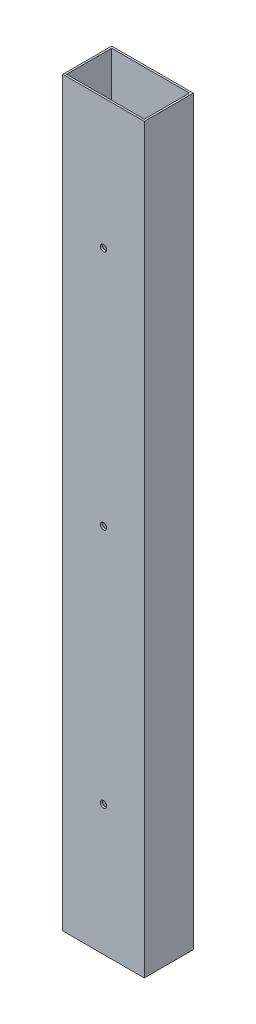
ISO-10303-21;
HEADER;
FILE_DESCRIPTION(('STEP AP214'),'2;1');
FILE_NAME('part.step','',(''),(''),'','','');
FILE_SCHEMA(('AUTOMOTIVE_DESIGN { 1 0 10303 214 1 1 1 1 }'));
ENDSEC;
DATA;
#1=APPLICATION_CONTEXT('core data for automotive mechanical design processes');
#2=APPLICATION_PROTOCOL_DEFINITION('international standard','automotive_design',2000,#1);
#3=PRODUCT_CONTEXT('',#1,'mechanical');
#4=PRODUCT('Part','Part','',(#3));
#5=PRODUCT_RELATED_PRODUCT_CATEGORY('part','',(#4));
#6=PRODUCT_DEFINITION_FORMATION('','',#4);
#7=PRODUCT_DEFINITION_CONTEXT('part definition',#1,'design');
#8=PRODUCT_DEFINITION('design','',#6,#7);
#9=PRODUCT_DEFINITION_SHAPE('','',#8);
#10=(LENGTH_UNIT() NAMED_UNIT(*) SI_UNIT(.MILLI.,.METRE.));
#11=(NAMED_UNIT(*) PLANE_ANGLE_UNIT() SI_UNIT($,.RADIAN.));
#12=(NAMED_UNIT(*) SI_UNIT($,.STERADIAN.) SOLID_ANGLE_UNIT());
#13=UNCERTAINTY_MEASURE_WITH_UNIT(LENGTH_MEASURE(1.E-05),#10,'distance_accuracy_value','');
#14=(GEOMETRIC_REPRESENTATION_CONTEXT(3) GLOBAL_UNCERTAINTY_ASSIGNED_CONTEXT((#13)) GLOBAL_UNIT_ASSIGNED_CONTEXT((#10,
#11,#12)) REPRESENTATION_CONTEXT('',''));
#15=CARTESIAN_POINT('',(0.,0.,0.));
#16=DIRECTION('',(0.,0.,1.));
#17=DIRECTION('',(1.,0.,0.));
#18=AXIS2_PLACEMENT_3D('',#15,#16,#17);
#19=CARTESIAN_POINT('',(0.,462.,0.));
#20=DIRECTION('',(0.,-1.,0.));
#21=DIRECTION('',(0.,0.,-1.));
#22=AXIS2_PLACEMENT_3D('',#19,#20,#21);
#23=PLANE('',#22);
#24=DIRECTION('',(0.,0.,-1.));
#25=VECTOR('',#24,1.);
#26=CARTESIAN_POINT('',(25.4,462.,15.25));
#27=LINE('',#26,#25);
#28=CARTESIAN_POINT('',(25.4,462.,15.25));
#29=VERTEX_POINT('',#28);
#30=CARTESIAN_POINT('',(25.4,462.,-15.25));
#31=VERTEX_POINT('',#30);
#32=EDGE_CURVE('E156',#29,#31,#27,.T.);
#33=ORIENTED_EDGE('',*,*,#32,.T.);
#34=DIRECTION('',(-1.,0.,0.));
#35=VECTOR('',#34,1.);
#36=CARTESIAN_POINT('',(-25.4,462.,-15.25));
#37=LINE('',#36,#35);
#38=CARTESIAN_POINT('',(-25.4,462.,-15.25));
#39=VERTEX_POINT('',#38);
#40=EDGE_CURVE('E160',#31,#39,#37,.T.);
#41=ORIENTED_EDGE('',*,*,#40,.T.);
#42=DIRECTION('',(0.,0.,1.));
#43=VECTOR('',#42,1.);
#44=CARTESIAN_POINT('',(-25.4,462.,15.25));
#45=LINE('',#44,#43);
#46=CARTESIAN_POINT('',(-25.4,462.,15.25));
#47=VERTEX_POINT('',#46);
#48=EDGE_CURVE('E164',#39,#47,#45,.T.);
#49=ORIENTED_EDGE('',*,*,#48,.T.);
#50=DIRECTION('',(1.,0.,0.));
#51=VECTOR('',#50,1.);
#52=CARTESIAN_POINT('',(-25.4,462.,15.25));
#53=LINE('',#52,#51);
#54=EDGE_CURVE('E167',#47,#29,#53,.T.);
#55=ORIENTED_EDGE('',*,*,#54,.T.);
#56=EDGE_LOOP('',(#33,#41,#49,#55));
#57=FACE_BOUND('',#56,.T.);
#58=DIRECTION('',(0.,0.,1.));
#59=VECTOR('',#58,1.);
#60=CARTESIAN_POINT('',(-24.2,462.,14.05));
#61=LINE('',#60,#59);
#62=CARTESIAN_POINT('',(-24.2,462.,-14.05));
#63=VERTEX_POINT('',#62);
#64=CARTESIAN_POINT('',(-24.2,462.,14.05));
#65=VERTEX_POINT('',#64);
#66=EDGE_CURVE('E106',#63,#65,#61,.T.);
#67=ORIENTED_EDGE('',*,*,#66,.F.);
#68=DIRECTION('',(-1.,0.,0.));
#69=VECTOR('',#68,1.);
#70=CARTESIAN_POINT('',(-24.2,462.,-14.05));
#71=LINE('',#70,#69);
#72=CARTESIAN_POINT('',(24.2,462.,-14.05));
#73=VERTEX_POINT('',#72);
#74=EDGE_CURVE('E132',#73,#63,#71,.T.);
#75=ORIENTED_EDGE('',*,*,#74,.F.);
#76=DIRECTION('',(0.,0.,-1.));
#77=VECTOR('',#76,1.);
#78=CARTESIAN_POINT('',(24.2,462.,14.05));
#79=LINE('',#78,#77);
#80=CARTESIAN_POINT('',(24.2,462.,14.05));
#81=VERTEX_POINT('',#80);
#82=EDGE_CURVE('E128',#81,#73,#79,.T.);
#83=ORIENTED_EDGE('',*,*,#82,.F.);
#84=DIRECTION('',(1.,0.,0.));
#85=VECTOR('',#84,1.);
#86=CARTESIAN_POINT('',(-24.2,462.,14.05));
#87=LINE('',#86,#85);
#88=EDGE_CURVE('E115',#65,#81,#87,.T.);
#89=ORIENTED_EDGE('',*,*,#88,.F.);
#90=EDGE_LOOP('',(#67,#75,#83,#89));
#91=FACE_BOUND('',#90,.T.);
#92=ADVANCED_FACE('F38',(#57,#91),#23,.F.);
#93=CARTESIAN_POINT('',(0.,0.,0.));
#94=DIRECTION('',(0.,-1.,0.));
#95=DIRECTION('',(0.,0.,-1.));
#96=AXIS2_PLACEMENT_3D('',#93,#94,#95);
#97=PLANE('',#96);
#98=DIRECTION('',(0.,0.,-1.));
#99=VECTOR('',#98,1.);
#100=CARTESIAN_POINT('',(25.4,0.,15.25));
#101=LINE('',#100,#99);
#102=CARTESIAN_POINT('',(25.4,0.,15.25));
#103=VERTEX_POINT('',#102);
#104=CARTESIAN_POINT('',(25.4,0.,-15.25));
#105=VERTEX_POINT('',#104);
#106=EDGE_CURVE('E124',#103,#105,#101,.T.);
#107=ORIENTED_EDGE('',*,*,#106,.F.);
#108=DIRECTION('',(1.,0.,0.));
#109=VECTOR('',#108,1.);
#110=CARTESIAN_POINT('',(-25.4,0.,15.25));
#111=LINE('',#110,#109);
#112=CARTESIAN_POINT('',(-25.4,0.,15.25));
#113=VERTEX_POINT('',#112);
#114=EDGE_CURVE('E161',#113,#103,#111,.T.);
#115=ORIENTED_EDGE('',*,*,#114,.F.);
#116=DIRECTION('',(0.,0.,1.));
#117=VECTOR('',#116,1.);
#118=CARTESIAN_POINT('',(-25.4,0.,15.25));
#119=LINE('',#118,#117);
#120=CARTESIAN_POINT('',(-25.4,0.,-15.25));
#121=VERTEX_POINT('',#120);
#122=EDGE_CURVE('E177',#121,#113,#119,.T.);
#123=ORIENTED_EDGE('',*,*,#122,.F.);
#124=DIRECTION('',(-1.,0.,0.));
#125=VECTOR('',#124,1.);
#126=CARTESIAN_POINT('',(-25.4,0.,-15.25));
#127=LINE('',#126,#125);
#128=EDGE_CURVE('E174',#105,#121,#127,.T.);
#129=ORIENTED_EDGE('',*,*,#128,.F.);
#130=EDGE_LOOP('',(#107,#115,#123,#129));
#131=FACE_BOUND('',#130,.T.);
#132=DIRECTION('',(-1.,0.,0.));
#133=VECTOR('',#132,1.);
#134=CARTESIAN_POINT('',(-24.2,0.,-14.05));
#135=LINE('',#134,#133);
#136=CARTESIAN_POINT('',(24.2,0.,-14.05));
#137=VERTEX_POINT('',#136);
#138=CARTESIAN_POINT('',(-24.2,0.,-14.05));
#139=VERTEX_POINT('',#138);
#140=EDGE_CURVE('E116',#137,#139,#135,.T.);
#141=ORIENTED_EDGE('',*,*,#140,.T.);
#142=DIRECTION('',(0.,0.,1.));
#143=VECTOR('',#142,1.);
#144=CARTESIAN_POINT('',(-24.2,0.,14.05));
#145=LINE('',#144,#143);
#146=CARTESIAN_POINT('',(-24.2,0.,14.05));
#147=VERTEX_POINT('',#146);
#148=EDGE_CURVE('E64',#139,#147,#145,.T.);
#149=ORIENTED_EDGE('',*,*,#148,.T.);
#150=DIRECTION('',(1.,0.,0.));
#151=VECTOR('',#150,1.);
#152=CARTESIAN_POINT('',(-24.2,0.,14.05));
#153=LINE('',#152,#151);
#154=CARTESIAN_POINT('',(24.2,0.,14.05));
#155=VERTEX_POINT('',#154);
#156=EDGE_CURVE('E122',#147,#155,#153,.T.);
#157=ORIENTED_EDGE('',*,*,#156,.T.);
#158=DIRECTION('',(0.,0.,-1.));
#159=VECTOR('',#158,1.);
#160=CARTESIAN_POINT('',(24.2,0.,14.05));
#161=LINE('',#160,#159);
#162=EDGE_CURVE('E143',#155,#137,#161,.T.);
#163=ORIENTED_EDGE('',*,*,#162,.T.);
#164=EDGE_LOOP('',(#141,#149,#157,#163));
#165=FACE_BOUND('',#164,.T.);
#166=ADVANCED_FACE('F235',(#131,#165),#97,.T.);
#167=CARTESIAN_POINT('',(25.4,462.,15.25));
#168=DIRECTION('',(-1.,0.,0.));
#169=DIRECTION('',(0.,0.,1.));
#170=AXIS2_PLACEMENT_3D('',#167,#168,#169);
#171=PLANE('',#170);
#172=ORIENTED_EDGE('',*,*,#106,.T.);
#173=DIRECTION('',(0.,-1.,0.));
#174=VECTOR('',#173,1.);
#175=CARTESIAN_POINT('',(25.4,462.,-15.25));
#176=LINE('',#175,#174);
#177=EDGE_CURVE('E11',#31,#105,#176,.T.);
#178=ORIENTED_EDGE('',*,*,#177,.F.);
#179=ORIENTED_EDGE('',*,*,#32,.F.);
#180=DIRECTION('',(0.,-1.,0.));
#181=VECTOR('',#180,1.);
#182=CARTESIAN_POINT('',(25.4,462.,15.25));
#183=LINE('',#182,#181);
#184=EDGE_CURVE('E170',#29,#103,#183,.T.);
#185=ORIENTED_EDGE('',*,*,#184,.T.);
#186=EDGE_LOOP('',(#172,#178,#179,#185));
#187=FACE_BOUND('',#186,.T.);
#188=ADVANCED_FACE('F40',(#187),#171,.F.);
#189=CARTESIAN_POINT('',(-25.4,462.,-15.25));
#190=DIRECTION('',(0.,0.,1.));
#191=DIRECTION('',(1.,0.,0.));
#192=AXIS2_PLACEMENT_3D('',#189,#190,#191);
#193=PLANE('',#192);
#194=CARTESIAN_POINT('',(0.,81.,-15.25));
#195=DIRECTION('',(0.,0.,-1.));
#196=DIRECTION('',(-1.,0.,0.));
#197=AXIS2_PLACEMENT_3D('',#194,#195,#196);
#198=CIRCLE('',#197,2.);
#199=CARTESIAN_POINT('',(-2.00000000000002,81.,-15.25));
#200=VERTEX_POINT('',#199);
#201=EDGE_CURVE('E273',#200,#200,#198,.T.);
#202=ORIENTED_EDGE('',*,*,#201,.F.);
#203=EDGE_LOOP('',(#202));
#204=FACE_BOUND('',#203,.T.);
#205=CARTESIAN_POINT('',(0.,381.,-15.25));
#206=DIRECTION('',(0.,0.,-1.));
#207=DIRECTION('',(-1.,0.,0.));
#208=AXIS2_PLACEMENT_3D('',#205,#206,#207);
#209=CIRCLE('',#208,2.);
#210=CARTESIAN_POINT('',(-2.00000000000001,381.,-15.25));
#211=VERTEX_POINT('',#210);
#212=EDGE_CURVE('E277',#211,#211,#209,.T.);
#213=ORIENTED_EDGE('',*,*,#212,.F.);
#214=EDGE_LOOP('',(#213));
#215=FACE_BOUND('',#214,.T.);
#216=CARTESIAN_POINT('',(0.,231.,-15.25));
#217=DIRECTION('',(0.,0.,-1.));
#218=DIRECTION('',(-1.,0.,0.));
#219=AXIS2_PLACEMENT_3D('',#216,#217,#218);
#220=CIRCLE('',#219,2.);
#221=CARTESIAN_POINT('',(-2.00000000000001,231.,-15.25));
#222=VERTEX_POINT('',#221);
#223=EDGE_CURVE('E212',#222,#222,#220,.T.);
#224=ORIENTED_EDGE('',*,*,#223,.F.);
#225=EDGE_LOOP('',(#224));
#226=FACE_BOUND('',#225,.T.);
#227=ORIENTED_EDGE('',*,*,#128,.T.);
#228=DIRECTION('',(0.,-1.,0.));
#229=VECTOR('',#228,1.);
#230=CARTESIAN_POINT('',(-25.4,462.,-15.25));
#231=LINE('',#230,#229);
#232=EDGE_CURVE('E48',#39,#121,#231,.T.);
#233=ORIENTED_EDGE('',*,*,#232,.F.);
#234=ORIENTED_EDGE('',*,*,#40,.F.);
#235=ORIENTED_EDGE('',*,*,#177,.T.);
#236=EDGE_LOOP('',(#227,#233,#234,#235));
#237=FACE_BOUND('',#236,.T.);
#238=ADVANCED_FACE('F262',(#204,#215,#226,#237),#193,.F.);
#239=CARTESIAN_POINT('',(-25.4,462.,15.25));
#240=DIRECTION('',(1.,0.,0.));
#241=DIRECTION('',(0.,0.,-1.));
#242=AXIS2_PLACEMENT_3D('',#239,#240,#241);
#243=PLANE('',#242);
#244=ORIENTED_EDGE('',*,*,#122,.T.);
#245=DIRECTION('',(0.,-1.,0.));
#246=VECTOR('',#245,1.);
#247=CARTESIAN_POINT('',(-25.4,462.,15.25));
#248=LINE('',#247,#246);
#249=EDGE_CURVE('E185',#47,#113,#248,.T.);
#250=ORIENTED_EDGE('',*,*,#249,.F.);
#251=ORIENTED_EDGE('',*,*,#48,.F.);
#252=ORIENTED_EDGE('',*,*,#232,.T.);
#253=EDGE_LOOP('',(#244,#250,#251,#252));
#254=FACE_BOUND('',#253,.T.);
#255=ADVANCED_FACE('F259',(#254),#243,.F.);
#256=CARTESIAN_POINT('',(-25.4,462.,15.25));
#257=DIRECTION('',(0.,0.,-1.));
#258=DIRECTION('',(-1.,0.,0.));
#259=AXIS2_PLACEMENT_3D('',#256,#257,#258);
#260=PLANE('',#259);
#261=CARTESIAN_POINT('',(0.,81.,15.25));
#262=DIRECTION('',(0.,0.,-1.));
#263=DIRECTION('',(-1.,0.,0.));
#264=AXIS2_PLACEMENT_3D('',#261,#262,#263);
#265=CIRCLE('',#264,2.);
#266=CARTESIAN_POINT('',(-2.00000000000002,81.,15.25));
#267=VERTEX_POINT('',#266);
#268=EDGE_CURVE('E303',#267,#267,#265,.T.);
#269=ORIENTED_EDGE('',*,*,#268,.T.);
#270=EDGE_LOOP('',(#269));
#271=FACE_BOUND('',#270,.T.);
#272=CARTESIAN_POINT('',(0.,381.,15.25));
#273=DIRECTION('',(0.,0.,-1.));
#274=DIRECTION('',(-1.,0.,0.));
#275=AXIS2_PLACEMENT_3D('',#272,#273,#274);
#276=CIRCLE('',#275,2.);
#277=CARTESIAN_POINT('',(-2.00000000000001,381.,15.25));
#278=VERTEX_POINT('',#277);
#279=EDGE_CURVE('E294',#278,#278,#276,.T.);
#280=ORIENTED_EDGE('',*,*,#279,.T.);
#281=EDGE_LOOP('',(#280));
#282=FACE_BOUND('',#281,.T.);
#283=CARTESIAN_POINT('',(0.,231.,15.25));
#284=DIRECTION('',(0.,0.,-1.));
#285=DIRECTION('',(-1.,0.,0.));
#286=AXIS2_PLACEMENT_3D('',#283,#284,#285);
#287=CIRCLE('',#286,2.);
#288=CARTESIAN_POINT('',(-2.00000000000001,231.,15.25));
#289=VERTEX_POINT('',#288);
#290=EDGE_CURVE('E196',#289,#289,#287,.T.);
#291=ORIENTED_EDGE('',*,*,#290,.T.);
#292=EDGE_LOOP('',(#291));
#293=FACE_BOUND('',#292,.T.);
#294=ORIENTED_EDGE('',*,*,#114,.T.);
#295=ORIENTED_EDGE('',*,*,#184,.F.);
#296=ORIENTED_EDGE('',*,*,#54,.F.);
#297=ORIENTED_EDGE('',*,*,#249,.T.);
#298=EDGE_LOOP('',(#294,#295,#296,#297));
#299=FACE_BOUND('',#298,.T.);
#300=ADVANCED_FACE('F256',(#271,#282,#293,#299),#260,.F.);
#301=CARTESIAN_POINT('',(-24.2,462.,14.05));
#302=DIRECTION('',(1.,0.,0.));
#303=DIRECTION('',(0.,0.,-1.));
#304=AXIS2_PLACEMENT_3D('',#301,#302,#303);
#305=PLANE('',#304);
#306=ORIENTED_EDGE('',*,*,#148,.F.);
#307=DIRECTION('',(0.,-1.,0.));
#308=VECTOR('',#307,1.);
#309=CARTESIAN_POINT('',(-24.2,462.,-14.05));
#310=LINE('',#309,#308);
#311=EDGE_CURVE('E110',#63,#139,#310,.T.);
#312=ORIENTED_EDGE('',*,*,#311,.F.);
#313=ORIENTED_EDGE('',*,*,#66,.T.);
#314=DIRECTION('',(0.,-1.,0.));
#315=VECTOR('',#314,1.);
#316=CARTESIAN_POINT('',(-24.2,462.,14.05));
#317=LINE('',#316,#315);
#318=EDGE_CURVE('E109',#65,#147,#317,.T.);
#319=ORIENTED_EDGE('',*,*,#318,.T.);
#320=EDGE_LOOP('',(#306,#312,#313,#319));
#321=FACE_BOUND('',#320,.T.);
#322=ADVANCED_FACE('F108',(#321),#305,.T.);
#323=CARTESIAN_POINT('',(-24.2,462.,14.05));
#324=DIRECTION('',(0.,0.,-1.));
#325=DIRECTION('',(-1.,0.,0.));
#326=AXIS2_PLACEMENT_3D('',#323,#324,#325);
#327=PLANE('',#326);
#328=CARTESIAN_POINT('',(0.,81.,14.05));
#329=DIRECTION('',(0.,0.,-1.));
#330=DIRECTION('',(-1.,0.,0.));
#331=AXIS2_PLACEMENT_3D('',#328,#329,#330);
#332=CIRCLE('',#331,2.);
#333=CARTESIAN_POINT('',(-2.00000000000002,81.,14.05));
#334=VERTEX_POINT('',#333);
#335=EDGE_CURVE('E140',#334,#334,#332,.T.);
#336=ORIENTED_EDGE('',*,*,#335,.F.);
#337=EDGE_LOOP('',(#336));
#338=FACE_BOUND('',#337,.T.);
#339=CARTESIAN_POINT('',(0.,381.,14.05));
#340=DIRECTION('',(0.,0.,-1.));
#341=DIRECTION('',(-1.,0.,0.));
#342=AXIS2_PLACEMENT_3D('',#339,#340,#341);
#343=CIRCLE('',#342,2.);
#344=CARTESIAN_POINT('',(-2.00000000000001,381.,14.05));
#345=VERTEX_POINT('',#344);
#346=EDGE_CURVE('E200',#345,#345,#343,.T.);
#347=ORIENTED_EDGE('',*,*,#346,.F.);
#348=EDGE_LOOP('',(#347));
#349=FACE_BOUND('',#348,.T.);
#350=CARTESIAN_POINT('',(0.,231.,14.05));
#351=DIRECTION('',(0.,0.,-1.));
#352=DIRECTION('',(-1.,0.,0.));
#353=AXIS2_PLACEMENT_3D('',#350,#351,#352);
#354=CIRCLE('',#353,2.);
#355=CARTESIAN_POINT('',(-2.00000000000001,231.,14.05));
#356=VERTEX_POINT('',#355);
#357=EDGE_CURVE('E195',#356,#356,#354,.T.);
#358=ORIENTED_EDGE('',*,*,#357,.F.);
#359=EDGE_LOOP('',(#358));
#360=FACE_BOUND('',#359,.T.);
#361=ORIENTED_EDGE('',*,*,#156,.F.);
#362=ORIENTED_EDGE('',*,*,#318,.F.);
#363=ORIENTED_EDGE('',*,*,#88,.T.);
#364=DIRECTION('',(0.,-1.,0.));
#365=VECTOR('',#364,1.);
#366=CARTESIAN_POINT('',(24.2,462.,14.05));
#367=LINE('',#366,#365);
#368=EDGE_CURVE('E125',#81,#155,#367,.T.);
#369=ORIENTED_EDGE('',*,*,#368,.T.);
#370=EDGE_LOOP('',(#361,#362,#363,#369));
#371=FACE_BOUND('',#370,.T.);
#372=ADVANCED_FACE('F119',(#338,#349,#360,#371),#327,.T.);
#373=CARTESIAN_POINT('',(24.2,462.,14.05));
#374=DIRECTION('',(-1.,0.,0.));
#375=DIRECTION('',(0.,0.,1.));
#376=AXIS2_PLACEMENT_3D('',#373,#374,#375);
#377=PLANE('',#376);
#378=ORIENTED_EDGE('',*,*,#162,.F.);
#379=ORIENTED_EDGE('',*,*,#368,.F.);
#380=ORIENTED_EDGE('',*,*,#82,.T.);
#381=DIRECTION('',(0.,-1.,0.));
#382=VECTOR('',#381,1.);
#383=CARTESIAN_POINT('',(24.2,462.,-14.05));
#384=LINE('',#383,#382);
#385=EDGE_CURVE('E56',#73,#137,#384,.T.);
#386=ORIENTED_EDGE('',*,*,#385,.T.);
#387=EDGE_LOOP('',(#378,#379,#380,#386));
#388=FACE_BOUND('',#387,.T.);
#389=ADVANCED_FACE('F229',(#388),#377,.T.);
#390=CARTESIAN_POINT('',(-24.2,462.,-14.05));
#391=DIRECTION('',(0.,0.,1.));
#392=DIRECTION('',(1.,0.,0.));
#393=AXIS2_PLACEMENT_3D('',#390,#391,#392);
#394=PLANE('',#393);
#395=CARTESIAN_POINT('',(0.,81.,-14.05));
#396=DIRECTION('',(0.,0.,1.));
#397=DIRECTION('',(1.,0.,0.));
#398=AXIS2_PLACEMENT_3D('',#395,#396,#397);
#399=CIRCLE('',#398,2.);
#400=CARTESIAN_POINT('',(-2.00000000000002,81.,-14.05));
#401=VERTEX_POINT('',#400);
#402=EDGE_CURVE('E42',#401,#401,#399,.T.);
#403=ORIENTED_EDGE('',*,*,#402,.F.);
#404=EDGE_LOOP('',(#403));
#405=FACE_BOUND('',#404,.T.);
#406=CARTESIAN_POINT('',(0.,381.,-14.05));
#407=DIRECTION('',(0.,0.,1.));
#408=DIRECTION('',(1.,0.,0.));
#409=AXIS2_PLACEMENT_3D('',#406,#407,#408);
#410=CIRCLE('',#409,2.);
#411=CARTESIAN_POINT('',(-2.00000000000001,381.,-14.05));
#412=VERTEX_POINT('',#411);
#413=EDGE_CURVE('E197',#412,#412,#410,.T.);
#414=ORIENTED_EDGE('',*,*,#413,.F.);
#415=EDGE_LOOP('',(#414));
#416=FACE_BOUND('',#415,.T.);
#417=CARTESIAN_POINT('',(0.,231.,-14.05));
#418=DIRECTION('',(0.,0.,1.));
#419=DIRECTION('',(1.,0.,0.));
#420=AXIS2_PLACEMENT_3D('',#417,#418,#419);
#421=CIRCLE('',#420,2.);
#422=CARTESIAN_POINT('',(-2.00000000000001,231.,-14.05));
#423=VERTEX_POINT('',#422);
#424=EDGE_CURVE('E192',#423,#423,#421,.T.);
#425=ORIENTED_EDGE('',*,*,#424,.F.);
#426=EDGE_LOOP('',(#425));
#427=FACE_BOUND('',#426,.T.);
#428=ORIENTED_EDGE('',*,*,#140,.F.);
#429=ORIENTED_EDGE('',*,*,#385,.F.);
#430=ORIENTED_EDGE('',*,*,#74,.T.);
#431=ORIENTED_EDGE('',*,*,#311,.T.);
#432=EDGE_LOOP('',(#428,#429,#430,#431));
#433=FACE_BOUND('',#432,.T.);
#434=ADVANCED_FACE('F225',(#405,#416,#427,#433),#394,.T.);
#435=CARTESIAN_POINT('',(0.,231.,15.25));
#436=DIRECTION('',(0.,0.,-1.));
#437=DIRECTION('',(-1.,0.,0.));
#438=AXIS2_PLACEMENT_3D('',#435,#436,#437);
#439=CYLINDRICAL_SURFACE('',#438,2.);
#440=CARTESIAN_POINT('',(-2.00000000000001,231.,-14.05));
#441=CARTESIAN_POINT('',(-2.00000000000001,231.,-14.0625));
#442=CARTESIAN_POINT('',(-2.00000000000001,231.,-14.075));
#443=CARTESIAN_POINT('',(-2.00000000000001,231.,-14.1));
#444=CARTESIAN_POINT('',(-2.00000000000001,231.,-14.1125));
#445=CARTESIAN_POINT('',(-2.00000000000001,231.,-14.1375));
#446=CARTESIAN_POINT('',(-2.00000000000001,231.,-14.15));
#447=CARTESIAN_POINT('',(-2.00000000000001,231.,-14.175));
#448=CARTESIAN_POINT('',(-2.00000000000001,231.,-14.1875));
#449=CARTESIAN_POINT('',(-2.00000000000001,231.,-14.2125));
#450=CARTESIAN_POINT('',(-2.00000000000001,231.,-14.225));
#451=CARTESIAN_POINT('',(-2.00000000000001,231.,-14.25));
#452=CARTESIAN_POINT('',(-2.00000000000001,231.,-14.2625));
#453=CARTESIAN_POINT('',(-2.00000000000001,231.,-14.2875));
#454=CARTESIAN_POINT('',(-2.00000000000001,231.,-14.3));
#455=CARTESIAN_POINT('',(-2.00000000000001,231.,-14.325));
#456=CARTESIAN_POINT('',(-2.00000000000001,231.,-14.3375));
#457=CARTESIAN_POINT('',(-2.00000000000001,231.,-14.3625));
#458=CARTESIAN_POINT('',(-2.00000000000001,231.,-14.375));
#459=CARTESIAN_POINT('',(-2.00000000000001,231.,-14.4));
#460=CARTESIAN_POINT('',(-2.00000000000001,231.,-14.4125));
#461=CARTESIAN_POINT('',(-2.00000000000001,231.,-14.4375));
#462=CARTESIAN_POINT('',(-2.00000000000001,231.,-14.45));
#463=CARTESIAN_POINT('',(-2.00000000000001,231.,-14.475));
#464=CARTESIAN_POINT('',(-2.00000000000001,231.,-14.4875));
#465=CARTESIAN_POINT('',(-2.00000000000001,231.,-14.5125));
#466=CARTESIAN_POINT('',(-2.00000000000001,231.,-14.525));
#467=CARTESIAN_POINT('',(-2.00000000000001,231.,-14.55));
#468=CARTESIAN_POINT('',(-2.00000000000001,231.,-14.5625));
#469=CARTESIAN_POINT('',(-2.00000000000001,231.,-14.5875));
#470=CARTESIAN_POINT('',(-2.00000000000001,231.,-14.6));
#471=CARTESIAN_POINT('',(-2.00000000000001,231.,-14.625));
#472=CARTESIAN_POINT('',(-2.00000000000001,231.,-14.6375));
#473=CARTESIAN_POINT('',(-2.00000000000001,231.,-14.6625));
#474=CARTESIAN_POINT('',(-2.00000000000001,231.,-14.675));
#475=CARTESIAN_POINT('',(-2.00000000000001,231.,-14.7));
#476=CARTESIAN_POINT('',(-2.00000000000001,231.,-14.7125));
#477=CARTESIAN_POINT('',(-2.00000000000001,231.,-14.7375));
#478=CARTESIAN_POINT('',(-2.00000000000001,231.,-14.75));
#479=CARTESIAN_POINT('',(-2.00000000000001,231.,-14.775));
#480=CARTESIAN_POINT('',(-2.00000000000001,231.,-14.7875));
#481=CARTESIAN_POINT('',(-2.00000000000001,231.,-14.8125));
#482=CARTESIAN_POINT('',(-2.00000000000001,231.,-14.825));
#483=CARTESIAN_POINT('',(-2.00000000000001,231.,-14.85));
#484=CARTESIAN_POINT('',(-2.00000000000001,231.,-14.8625));
#485=CARTESIAN_POINT('',(-2.00000000000001,231.,-14.8875));
#486=CARTESIAN_POINT('',(-2.00000000000001,231.,-14.9));
#487=CARTESIAN_POINT('',(-2.00000000000001,231.,-14.925));
#488=CARTESIAN_POINT('',(-2.00000000000001,231.,-14.9375));
#489=CARTESIAN_POINT('',(-2.00000000000001,231.,-14.9625));
#490=CARTESIAN_POINT('',(-2.00000000000001,231.,-14.975));
#491=CARTESIAN_POINT('',(-2.00000000000001,231.,-15.));
#492=CARTESIAN_POINT('',(-2.00000000000001,231.,-15.0125));
#493=CARTESIAN_POINT('',(-2.00000000000001,231.,-15.0375));
#494=CARTESIAN_POINT('',(-2.00000000000001,231.,-15.05));
#495=CARTESIAN_POINT('',(-2.00000000000001,231.,-15.075));
#496=CARTESIAN_POINT('',(-2.00000000000001,231.,-15.0875));
#497=CARTESIAN_POINT('',(-2.00000000000001,231.,-15.1125));
#498=CARTESIAN_POINT('',(-2.00000000000001,231.,-15.125));
#499=CARTESIAN_POINT('',(-2.00000000000001,231.,-15.15));
#500=CARTESIAN_POINT('',(-2.00000000000001,231.,-15.1625));
#501=CARTESIAN_POINT('',(-2.00000000000001,231.,-15.1875));
#502=CARTESIAN_POINT('',(-2.00000000000001,231.,-15.2));
#503=CARTESIAN_POINT('',(-2.00000000000001,231.,-15.225));
#504=CARTESIAN_POINT('',(-2.00000000000001,231.,-15.2375));
#505=CARTESIAN_POINT('',(-2.00000000000001,231.,-15.25));
#506=B_SPLINE_CURVE_WITH_KNOTS('',3,(#440,#441,#442,#443,#444,#445,#446,#447,#448,#449,#450,
#451,#452,#453,#454,#455,#456,#457,#458,#459,#460,#461,#462,#463,#464,#465,#466,#467,#468,#469,
#470,#471,#472,#473,#474,#475,#476,#477,#478,#479,#480,#481,#482,#483,#484,#485,#486,#487,#488,
#489,#490,#491,#492,#493,#494,#495,#496,#497,#498,#499,#500,#501,#502,#503,#504,#505),
.UNSPECIFIED.,.F.,.F.,(4,2,2,2,2,2,2,2,2,2,2,2,2,2,2,2,2,2,2,2,2,2,2,2,2,2,2,2,2,2,2,2,4),(0.,
0.0374999999999993,0.0749999999999987,0.112499999999998,0.149999999999997,0.1875,0.225,
0.262499999999999,0.299999999999998,0.337499999999998,0.374999999999997,0.412499999999996,
0.449999999999999,0.487499999999998,0.524999999999998,0.562499999999997,0.599999999999996,
0.637499999999996,0.674999999999995,0.712499999999994,0.749999999999994,0.787499999999997,
0.824999999999996,0.862499999999995,0.899999999999995,0.937499999999994,0.974999999999993,
1.01249999999999,1.05,1.08749999999999,1.12499999999999,1.16249999999999,1.19999999999999),.UNSPECIFIED.);
#507=EDGE_CURVE('BSEAM228',#423,#222,#506,.T.);
#508=ORIENTED_EDGE('',*,*,#424,.T.);
#509=ORIENTED_EDGE('',*,*,#223,.T.);
#510=ORIENTED_EDGE('',*,*,#507,.T.);
#511=ORIENTED_EDGE('',*,*,#507,.F.);
#512=EDGE_LOOP('',(#508,#510,#509,#511));
#513=FACE_BOUND('',#512,.T.);
#514=ADVANCED_FACE('F228',(#513),#439,.F.);
#515=CARTESIAN_POINT('',(0.,381.,15.25));
#516=DIRECTION('',(0.,0.,-1.));
#517=DIRECTION('',(-1.,0.,0.));
#518=AXIS2_PLACEMENT_3D('',#515,#516,#517);
#519=CYLINDRICAL_SURFACE('',#518,2.);
#520=CARTESIAN_POINT('',(-2.00000000000001,381.,-14.05));
#521=CARTESIAN_POINT('',(-2.00000000000001,381.,-14.0625));
#522=CARTESIAN_POINT('',(-2.00000000000001,381.,-14.075));
#523=CARTESIAN_POINT('',(-2.00000000000001,381.,-14.1));
#524=CARTESIAN_POINT('',(-2.00000000000001,381.,-14.1125));
#525=CARTESIAN_POINT('',(-2.00000000000001,381.,-14.1375));
#526=CARTESIAN_POINT('',(-2.00000000000001,381.,-14.15));
#527=CARTESIAN_POINT('',(-2.00000000000001,381.,-14.175));
#528=CARTESIAN_POINT('',(-2.00000000000001,381.,-14.1875));
#529=CARTESIAN_POINT('',(-2.00000000000001,381.,-14.2125));
#530=CARTESIAN_POINT('',(-2.00000000000001,381.,-14.225));
#531=CARTESIAN_POINT('',(-2.00000000000001,381.,-14.25));
#532=CARTESIAN_POINT('',(-2.00000000000001,381.,-14.2625));
#533=CARTESIAN_POINT('',(-2.00000000000001,381.,-14.2875));
#534=CARTESIAN_POINT('',(-2.00000000000001,381.,-14.3));
#535=CARTESIAN_POINT('',(-2.00000000000001,381.,-14.325));
#536=CARTESIAN_POINT('',(-2.00000000000001,381.,-14.3375));
#537=CARTESIAN_POINT('',(-2.00000000000001,381.,-14.3625));
#538=CARTESIAN_POINT('',(-2.00000000000001,381.,-14.375));
#539=CARTESIAN_POINT('',(-2.00000000000001,381.,-14.4));
#540=CARTESIAN_POINT('',(-2.00000000000001,381.,-14.4125));
#541=CARTESIAN_POINT('',(-2.00000000000001,381.,-14.4375));
#542=CARTESIAN_POINT('',(-2.00000000000001,381.,-14.45));
#543=CARTESIAN_POINT('',(-2.00000000000001,381.,-14.475));
#544=CARTESIAN_POINT('',(-2.00000000000001,381.,-14.4875));
#545=CARTESIAN_POINT('',(-2.00000000000001,381.,-14.5125));
#546=CARTESIAN_POINT('',(-2.00000000000001,381.,-14.525));
#547=CARTESIAN_POINT('',(-2.00000000000001,381.,-14.55));
#548=CARTESIAN_POINT('',(-2.00000000000001,381.,-14.5625));
#549=CARTESIAN_POINT('',(-2.00000000000001,381.,-14.5875));
#550=CARTESIAN_POINT('',(-2.00000000000001,381.,-14.6));
#551=CARTESIAN_POINT('',(-2.00000000000001,381.,-14.625));
#552=CARTESIAN_POINT('',(-2.00000000000001,381.,-14.6375));
#553=CARTESIAN_POINT('',(-2.00000000000001,381.,-14.6625));
#554=CARTESIAN_POINT('',(-2.00000000000001,381.,-14.675));
#555=CARTESIAN_POINT('',(-2.00000000000001,381.,-14.7));
#556=CARTESIAN_POINT('',(-2.00000000000001,381.,-14.7125));
#557=CARTESIAN_POINT('',(-2.00000000000001,381.,-14.7375));
#558=CARTESIAN_POINT('',(-2.00000000000001,381.,-14.75));
#559=CARTESIAN_POINT('',(-2.00000000000001,381.,-14.775));
#560=CARTESIAN_POINT('',(-2.00000000000001,381.,-14.7875));
#561=CARTESIAN_POINT('',(-2.00000000000001,381.,-14.8125));
#562=CARTESIAN_POINT('',(-2.00000000000001,381.,-14.825));
#563=CARTESIAN_POINT('',(-2.00000000000001,381.,-14.85));
#564=CARTESIAN_POINT('',(-2.00000000000001,381.,-14.8625));
#565=CARTESIAN_POINT('',(-2.00000000000001,381.,-14.8875));
#566=CARTESIAN_POINT('',(-2.00000000000001,381.,-14.9));
#567=CARTESIAN_POINT('',(-2.00000000000001,381.,-14.925));
#568=CARTESIAN_POINT('',(-2.00000000000001,381.,-14.9375));
#569=CARTESIAN_POINT('',(-2.00000000000001,381.,-14.9625));
#570=CARTESIAN_POINT('',(-2.00000000000001,381.,-14.975));
#571=CARTESIAN_POINT('',(-2.00000000000001,381.,-15.));
#572=CARTESIAN_POINT('',(-2.00000000000001,381.,-15.0125));
#573=CARTESIAN_POINT('',(-2.00000000000001,381.,-15.0375));
#574=CARTESIAN_POINT('',(-2.00000000000001,381.,-15.05));
#575=CARTESIAN_POINT('',(-2.00000000000001,381.,-15.075));
#576=CARTESIAN_POINT('',(-2.00000000000001,381.,-15.0875));
#577=CARTESIAN_POINT('',(-2.00000000000001,381.,-15.1125));
#578=CARTESIAN_POINT('',(-2.00000000000001,381.,-15.125));
#579=CARTESIAN_POINT('',(-2.00000000000001,381.,-15.15));
#580=CARTESIAN_POINT('',(-2.00000000000001,381.,-15.1625));
#581=CARTESIAN_POINT('',(-2.00000000000001,381.,-15.1875));
#582=CARTESIAN_POINT('',(-2.00000000000001,381.,-15.2));
#583=CARTESIAN_POINT('',(-2.00000000000001,381.,-15.225));
#584=CARTESIAN_POINT('',(-2.00000000000001,381.,-15.2375));
#585=CARTESIAN_POINT('',(-2.00000000000001,381.,-15.25));
#586=B_SPLINE_CURVE_WITH_KNOTS('',3,(#520,#521,#522,#523,#524,#525,#526,#527,#528,#529,#530,
#531,#532,#533,#534,#535,#536,#537,#538,#539,#540,#541,#542,#543,#544,#545,#546,#547,#548,#549,
#550,#551,#552,#553,#554,#555,#556,#557,#558,#559,#560,#561,#562,#563,#564,#565,#566,#567,#568,
#569,#570,#571,#572,#573,#574,#575,#576,#577,#578,#579,#580,#581,#582,#583,#584,#585),
.UNSPECIFIED.,.F.,.F.,(4,2,2,2,2,2,2,2,2,2,2,2,2,2,2,2,2,2,2,2,2,2,2,2,2,2,2,2,2,2,2,2,4),(0.,
0.0374999999999993,0.0749999999999987,0.112499999999998,0.149999999999997,0.1875,0.225,
0.262499999999999,0.299999999999998,0.337499999999998,0.374999999999997,0.412499999999996,
0.449999999999999,0.487499999999998,0.524999999999998,0.562499999999997,0.599999999999996,
0.637499999999996,0.674999999999995,0.712499999999994,0.749999999999994,0.787499999999997,
0.824999999999996,0.862499999999995,0.899999999999995,0.937499999999994,0.974999999999993,
1.01249999999999,1.05,1.08749999999999,1.12499999999999,1.16249999999999,1.19999999999999),.UNSPECIFIED.);
#587=EDGE_CURVE('BSEAM312',#412,#211,#586,.T.);
#588=ORIENTED_EDGE('',*,*,#413,.T.);
#589=ORIENTED_EDGE('',*,*,#212,.T.);
#590=ORIENTED_EDGE('',*,*,#587,.T.);
#591=ORIENTED_EDGE('',*,*,#587,.F.);
#592=EDGE_LOOP('',(#588,#590,#589,#591));
#593=FACE_BOUND('',#592,.T.);
#594=ADVANCED_FACE('F312',(#593),#519,.F.);
#595=CARTESIAN_POINT('',(0.,81.,15.25));
#596=DIRECTION('',(0.,0.,-1.));
#597=DIRECTION('',(-1.,0.,0.));
#598=AXIS2_PLACEMENT_3D('',#595,#596,#597);
#599=CYLINDRICAL_SURFACE('',#598,2.);
#600=CARTESIAN_POINT('',(-2.00000000000002,81.,-14.05));
#601=CARTESIAN_POINT('',(-2.00000000000002,81.,-14.0625));
#602=CARTESIAN_POINT('',(-2.00000000000002,81.,-14.075));
#603=CARTESIAN_POINT('',(-2.00000000000002,81.,-14.1));
#604=CARTESIAN_POINT('',(-2.00000000000002,81.,-14.1125));
#605=CARTESIAN_POINT('',(-2.00000000000002,81.,-14.1375));
#606=CARTESIAN_POINT('',(-2.00000000000002,81.,-14.15));
#607=CARTESIAN_POINT('',(-2.00000000000002,81.,-14.175));
#608=CARTESIAN_POINT('',(-2.00000000000002,81.,-14.1875));
#609=CARTESIAN_POINT('',(-2.00000000000002,81.,-14.2125));
#610=CARTESIAN_POINT('',(-2.00000000000002,81.,-14.225));
#611=CARTESIAN_POINT('',(-2.00000000000002,81.,-14.25));
#612=CARTESIAN_POINT('',(-2.00000000000002,81.,-14.2625));
#613=CARTESIAN_POINT('',(-2.00000000000002,81.,-14.2875));
#614=CARTESIAN_POINT('',(-2.00000000000002,81.,-14.3));
#615=CARTESIAN_POINT('',(-2.00000000000002,81.,-14.325));
#616=CARTESIAN_POINT('',(-2.00000000000002,81.,-14.3375));
#617=CARTESIAN_POINT('',(-2.00000000000002,81.,-14.3625));
#618=CARTESIAN_POINT('',(-2.00000000000002,81.,-14.375));
#619=CARTESIAN_POINT('',(-2.00000000000002,81.,-14.4));
#620=CARTESIAN_POINT('',(-2.00000000000002,81.,-14.4125));
#621=CARTESIAN_POINT('',(-2.00000000000002,81.,-14.4375));
#622=CARTESIAN_POINT('',(-2.00000000000002,81.,-14.45));
#623=CARTESIAN_POINT('',(-2.00000000000002,81.,-14.475));
#624=CARTESIAN_POINT('',(-2.00000000000002,81.,-14.4875));
#625=CARTESIAN_POINT('',(-2.00000000000002,81.,-14.5125));
#626=CARTESIAN_POINT('',(-2.00000000000002,81.,-14.525));
#627=CARTESIAN_POINT('',(-2.00000000000002,81.,-14.55));
#628=CARTESIAN_POINT('',(-2.00000000000002,81.,-14.5625));
#629=CARTESIAN_POINT('',(-2.00000000000002,81.,-14.5875));
#630=CARTESIAN_POINT('',(-2.00000000000002,81.,-14.6));
#631=CARTESIAN_POINT('',(-2.00000000000002,81.,-14.625));
#632=CARTESIAN_POINT('',(-2.00000000000002,81.,-14.6375));
#633=CARTESIAN_POINT('',(-2.00000000000002,81.,-14.6625));
#634=CARTESIAN_POINT('',(-2.00000000000002,81.,-14.675));
#635=CARTESIAN_POINT('',(-2.00000000000002,81.,-14.7));
#636=CARTESIAN_POINT('',(-2.00000000000002,81.,-14.7125));
#637=CARTESIAN_POINT('',(-2.00000000000002,81.,-14.7375));
#638=CARTESIAN_POINT('',(-2.00000000000002,81.,-14.75));
#639=CARTESIAN_POINT('',(-2.00000000000002,81.,-14.775));
#640=CARTESIAN_POINT('',(-2.00000000000002,81.,-14.7875));
#641=CARTESIAN_POINT('',(-2.00000000000002,81.,-14.8125));
#642=CARTESIAN_POINT('',(-2.00000000000002,81.,-14.825));
#643=CARTESIAN_POINT('',(-2.00000000000002,81.,-14.85));
#644=CARTESIAN_POINT('',(-2.00000000000002,81.,-14.8625));
#645=CARTESIAN_POINT('',(-2.00000000000002,81.,-14.8875));
#646=CARTESIAN_POINT('',(-2.00000000000002,81.,-14.9));
#647=CARTESIAN_POINT('',(-2.00000000000002,81.,-14.925));
#648=CARTESIAN_POINT('',(-2.00000000000002,81.,-14.9375));
#649=CARTESIAN_POINT('',(-2.00000000000002,81.,-14.9625));
#650=CARTESIAN_POINT('',(-2.00000000000002,81.,-14.975));
#651=CARTESIAN_POINT('',(-2.00000000000002,81.,-15.));
#652=CARTESIAN_POINT('',(-2.00000000000002,81.,-15.0125));
#653=CARTESIAN_POINT('',(-2.00000000000002,81.,-15.0375));
#654=CARTESIAN_POINT('',(-2.00000000000002,81.,-15.05));
#655=CARTESIAN_POINT('',(-2.00000000000002,81.,-15.075));
#656=CARTESIAN_POINT('',(-2.00000000000002,81.,-15.0875));
#657=CARTESIAN_POINT('',(-2.00000000000002,81.,-15.1125));
#658=CARTESIAN_POINT('',(-2.00000000000002,81.,-15.125));
#659=CARTESIAN_POINT('',(-2.00000000000002,81.,-15.15));
#660=CARTESIAN_POINT('',(-2.00000000000002,81.,-15.1625));
#661=CARTESIAN_POINT('',(-2.00000000000002,81.,-15.1875));
#662=CARTESIAN_POINT('',(-2.00000000000002,81.,-15.2));
#663=CARTESIAN_POINT('',(-2.00000000000002,81.,-15.225));
#664=CARTESIAN_POINT('',(-2.00000000000002,81.,-15.2375));
#665=CARTESIAN_POINT('',(-2.00000000000002,81.,-15.25));
#666=B_SPLINE_CURVE_WITH_KNOTS('',3,(#600,#601,#602,#603,#604,#605,#606,#607,#608,#609,#610,
#611,#612,#613,#614,#615,#616,#617,#618,#619,#620,#621,#622,#623,#624,#625,#626,#627,#628,#629,
#630,#631,#632,#633,#634,#635,#636,#637,#638,#639,#640,#641,#642,#643,#644,#645,#646,#647,#648,
#649,#650,#651,#652,#653,#654,#655,#656,#657,#658,#659,#660,#661,#662,#663,#664,#665),
.UNSPECIFIED.,.F.,.F.,(4,2,2,2,2,2,2,2,2,2,2,2,2,2,2,2,2,2,2,2,2,2,2,2,2,2,2,2,2,2,2,2,4),(0.,
0.0374999999999993,0.0749999999999987,0.112499999999998,0.149999999999997,0.1875,0.225,
0.262499999999999,0.299999999999998,0.337499999999998,0.374999999999997,0.412499999999996,
0.449999999999999,0.487499999999998,0.524999999999998,0.562499999999997,0.599999999999996,
0.637499999999996,0.674999999999995,0.712499999999994,0.749999999999994,0.787499999999997,
0.824999999999996,0.862499999999995,0.899999999999995,0.937499999999994,0.974999999999993,
1.01249999999999,1.05,1.08749999999999,1.12499999999999,1.16249999999999,1.19999999999999),.UNSPECIFIED.);
#667=EDGE_CURVE('BSEAM222',#401,#200,#666,.T.);
#668=ORIENTED_EDGE('',*,*,#402,.T.);
#669=ORIENTED_EDGE('',*,*,#201,.T.);
#670=ORIENTED_EDGE('',*,*,#667,.T.);
#671=ORIENTED_EDGE('',*,*,#667,.F.);
#672=EDGE_LOOP('',(#668,#670,#669,#671));
#673=FACE_BOUND('',#672,.T.);
#674=ADVANCED_FACE('F222',(#673),#599,.F.);
#675=CARTESIAN_POINT('',(-2.00000000000001,231.,14.05));
#676=CARTESIAN_POINT('',(-2.00000000000001,231.,14.0625));
#677=CARTESIAN_POINT('',(-2.00000000000001,231.,14.075));
#678=CARTESIAN_POINT('',(-2.00000000000001,231.,14.1));
#679=CARTESIAN_POINT('',(-2.00000000000001,231.,14.1125));
#680=CARTESIAN_POINT('',(-2.00000000000001,231.,14.1375));
#681=CARTESIAN_POINT('',(-2.00000000000001,231.,14.15));
#682=CARTESIAN_POINT('',(-2.00000000000001,231.,14.175));
#683=CARTESIAN_POINT('',(-2.00000000000001,231.,14.1875));
#684=CARTESIAN_POINT('',(-2.00000000000001,231.,14.2125));
#685=CARTESIAN_POINT('',(-2.00000000000001,231.,14.225));
#686=CARTESIAN_POINT('',(-2.00000000000001,231.,14.25));
#687=CARTESIAN_POINT('',(-2.00000000000001,231.,14.2625));
#688=CARTESIAN_POINT('',(-2.00000000000001,231.,14.2875));
#689=CARTESIAN_POINT('',(-2.00000000000001,231.,14.3));
#690=CARTESIAN_POINT('',(-2.00000000000001,231.,14.325));
#691=CARTESIAN_POINT('',(-2.00000000000001,231.,14.3375));
#692=CARTESIAN_POINT('',(-2.00000000000001,231.,14.3625));
#693=CARTESIAN_POINT('',(-2.00000000000001,231.,14.375));
#694=CARTESIAN_POINT('',(-2.00000000000001,231.,14.4));
#695=CARTESIAN_POINT('',(-2.00000000000001,231.,14.4125));
#696=CARTESIAN_POINT('',(-2.00000000000001,231.,14.4375));
#697=CARTESIAN_POINT('',(-2.00000000000001,231.,14.45));
#698=CARTESIAN_POINT('',(-2.00000000000001,231.,14.475));
#699=CARTESIAN_POINT('',(-2.00000000000001,231.,14.4875));
#700=CARTESIAN_POINT('',(-2.00000000000001,231.,14.5125));
#701=CARTESIAN_POINT('',(-2.00000000000001,231.,14.525));
#702=CARTESIAN_POINT('',(-2.00000000000001,231.,14.55));
#703=CARTESIAN_POINT('',(-2.00000000000001,231.,14.5625));
#704=CARTESIAN_POINT('',(-2.00000000000001,231.,14.5875));
#705=CARTESIAN_POINT('',(-2.00000000000001,231.,14.6));
#706=CARTESIAN_POINT('',(-2.00000000000001,231.,14.625));
#707=CARTESIAN_POINT('',(-2.00000000000001,231.,14.6375));
#708=CARTESIAN_POINT('',(-2.00000000000001,231.,14.6625));
#709=CARTESIAN_POINT('',(-2.00000000000001,231.,14.675));
#710=CARTESIAN_POINT('',(-2.00000000000001,231.,14.7));
#711=CARTESIAN_POINT('',(-2.00000000000001,231.,14.7125));
#712=CARTESIAN_POINT('',(-2.00000000000001,231.,14.7375));
#713=CARTESIAN_POINT('',(-2.00000000000001,231.,14.75));
#714=CARTESIAN_POINT('',(-2.00000000000001,231.,14.775));
#715=CARTESIAN_POINT('',(-2.00000000000001,231.,14.7875));
#716=CARTESIAN_POINT('',(-2.00000000000001,231.,14.8125));
#717=CARTESIAN_POINT('',(-2.00000000000001,231.,14.825));
#718=CARTESIAN_POINT('',(-2.00000000000001,231.,14.85));
#719=CARTESIAN_POINT('',(-2.00000000000001,231.,14.8625));
#720=CARTESIAN_POINT('',(-2.00000000000001,231.,14.8875));
#721=CARTESIAN_POINT('',(-2.00000000000001,231.,14.9));
#722=CARTESIAN_POINT('',(-2.00000000000001,231.,14.925));
#723=CARTESIAN_POINT('',(-2.00000000000001,231.,14.9375));
#724=CARTESIAN_POINT('',(-2.00000000000001,231.,14.9625));
#725=CARTESIAN_POINT('',(-2.00000000000001,231.,14.975));
#726=CARTESIAN_POINT('',(-2.00000000000001,231.,15.));
#727=CARTESIAN_POINT('',(-2.00000000000001,231.,15.0125));
#728=CARTESIAN_POINT('',(-2.00000000000001,231.,15.0375));
#729=CARTESIAN_POINT('',(-2.00000000000001,231.,15.05));
#730=CARTESIAN_POINT('',(-2.00000000000001,231.,15.075));
#731=CARTESIAN_POINT('',(-2.00000000000001,231.,15.0875));
#732=CARTESIAN_POINT('',(-2.00000000000001,231.,15.1125));
#733=CARTESIAN_POINT('',(-2.00000000000001,231.,15.125));
#734=CARTESIAN_POINT('',(-2.00000000000001,231.,15.15));
#735=CARTESIAN_POINT('',(-2.00000000000001,231.,15.1625));
#736=CARTESIAN_POINT('',(-2.00000000000001,231.,15.1875));
#737=CARTESIAN_POINT('',(-2.00000000000001,231.,15.2));
#738=CARTESIAN_POINT('',(-2.00000000000001,231.,15.225));
#739=CARTESIAN_POINT('',(-2.00000000000001,231.,15.2375));
#740=CARTESIAN_POINT('',(-2.00000000000001,231.,15.25));
#741=B_SPLINE_CURVE_WITH_KNOTS('',3,(#675,#676,#677,#678,#679,#680,#681,#682,#683,#684,#685,
#686,#687,#688,#689,#690,#691,#692,#693,#694,#695,#696,#697,#698,#699,#700,#701,#702,#703,#704,
#705,#706,#707,#708,#709,#710,#711,#712,#713,#714,#715,#716,#717,#718,#719,#720,#721,#722,#723,
#724,#725,#726,#727,#728,#729,#730,#731,#732,#733,#734,#735,#736,#737,#738,#739,#740),
.UNSPECIFIED.,.F.,.F.,(4,2,2,2,2,2,2,2,2,2,2,2,2,2,2,2,2,2,2,2,2,2,2,2,2,2,2,2,2,2,2,2,4),(0.,
0.0374999999999993,0.0749999999999987,0.1125,0.149999999999999,0.187499999999998,0.225,
0.262499999999999,0.3,0.337499999999999,0.374999999999999,0.4125,0.449999999999999,
0.487499999999998,0.524999999999999,0.562499999999999,0.6,0.637499999999999,0.674999999999998,
0.7125,0.749999999999999,0.787499999999998,0.824999999999999,0.862499999999999,0.9,
0.937499999999999,0.974999999999998,1.0125,1.05,1.0875,1.125,1.1625,1.2),.UNSPECIFIED.);
#742=EDGE_CURVE('BSEAM311',#356,#289,#741,.T.);
#743=ORIENTED_EDGE('',*,*,#357,.T.);
#744=ORIENTED_EDGE('',*,*,#290,.F.);
#745=ORIENTED_EDGE('',*,*,#742,.T.);
#746=ORIENTED_EDGE('',*,*,#742,.F.);
#747=EDGE_LOOP('',(#743,#745,#744,#746));
#748=FACE_BOUND('',#747,.T.);
#749=ADVANCED_FACE('F311',(#748),#439,.F.);
#750=CARTESIAN_POINT('',(-2.00000000000001,381.,14.05));
#751=CARTESIAN_POINT('',(-2.00000000000001,381.,14.0625));
#752=CARTESIAN_POINT('',(-2.00000000000001,381.,14.075));
#753=CARTESIAN_POINT('',(-2.00000000000001,381.,14.1));
#754=CARTESIAN_POINT('',(-2.00000000000001,381.,14.1125));
#755=CARTESIAN_POINT('',(-2.00000000000001,381.,14.1375));
#756=CARTESIAN_POINT('',(-2.00000000000001,381.,14.15));
#757=CARTESIAN_POINT('',(-2.00000000000001,381.,14.175));
#758=CARTESIAN_POINT('',(-2.00000000000001,381.,14.1875));
#759=CARTESIAN_POINT('',(-2.00000000000001,381.,14.2125));
#760=CARTESIAN_POINT('',(-2.00000000000001,381.,14.225));
#761=CARTESIAN_POINT('',(-2.00000000000001,381.,14.25));
#762=CARTESIAN_POINT('',(-2.00000000000001,381.,14.2625));
#763=CARTESIAN_POINT('',(-2.00000000000001,381.,14.2875));
#764=CARTESIAN_POINT('',(-2.00000000000001,381.,14.3));
#765=CARTESIAN_POINT('',(-2.00000000000001,381.,14.325));
#766=CARTESIAN_POINT('',(-2.00000000000001,381.,14.3375));
#767=CARTESIAN_POINT('',(-2.00000000000001,381.,14.3625));
#768=CARTESIAN_POINT('',(-2.00000000000001,381.,14.375));
#769=CARTESIAN_POINT('',(-2.00000000000001,381.,14.4));
#770=CARTESIAN_POINT('',(-2.00000000000001,381.,14.4125));
#771=CARTESIAN_POINT('',(-2.00000000000001,381.,14.4375));
#772=CARTESIAN_POINT('',(-2.00000000000001,381.,14.45));
#773=CARTESIAN_POINT('',(-2.00000000000001,381.,14.475));
#774=CARTESIAN_POINT('',(-2.00000000000001,381.,14.4875));
#775=CARTESIAN_POINT('',(-2.00000000000001,381.,14.5125));
#776=CARTESIAN_POINT('',(-2.00000000000001,381.,14.525));
#777=CARTESIAN_POINT('',(-2.00000000000001,381.,14.55));
#778=CARTESIAN_POINT('',(-2.00000000000001,381.,14.5625));
#779=CARTESIAN_POINT('',(-2.00000000000001,381.,14.5875));
#780=CARTESIAN_POINT('',(-2.00000000000001,381.,14.6));
#781=CARTESIAN_POINT('',(-2.00000000000001,381.,14.625));
#782=CARTESIAN_POINT('',(-2.00000000000001,381.,14.6375));
#783=CARTESIAN_POINT('',(-2.00000000000001,381.,14.6625));
#784=CARTESIAN_POINT('',(-2.00000000000001,381.,14.675));
#785=CARTESIAN_POINT('',(-2.00000000000001,381.,14.7));
#786=CARTESIAN_POINT('',(-2.00000000000001,381.,14.7125));
#787=CARTESIAN_POINT('',(-2.00000000000001,381.,14.7375));
#788=CARTESIAN_POINT('',(-2.00000000000001,381.,14.75));
#789=CARTESIAN_POINT('',(-2.00000000000001,381.,14.775));
#790=CARTESIAN_POINT('',(-2.00000000000001,381.,14.7875));
#791=CARTESIAN_POINT('',(-2.00000000000001,381.,14.8125));
#792=CARTESIAN_POINT('',(-2.00000000000001,381.,14.825));
#793=CARTESIAN_POINT('',(-2.00000000000001,381.,14.85));
#794=CARTESIAN_POINT('',(-2.00000000000001,381.,14.8625));
#795=CARTESIAN_POINT('',(-2.00000000000001,381.,14.8875));
#796=CARTESIAN_POINT('',(-2.00000000000001,381.,14.9));
#797=CARTESIAN_POINT('',(-2.00000000000001,381.,14.925));
#798=CARTESIAN_POINT('',(-2.00000000000001,381.,14.9375));
#799=CARTESIAN_POINT('',(-2.00000000000001,381.,14.9625));
#800=CARTESIAN_POINT('',(-2.00000000000001,381.,14.975));
#801=CARTESIAN_POINT('',(-2.00000000000001,381.,15.));
#802=CARTESIAN_POINT('',(-2.00000000000001,381.,15.0125));
#803=CARTESIAN_POINT('',(-2.00000000000001,381.,15.0375));
#804=CARTESIAN_POINT('',(-2.00000000000001,381.,15.05));
#805=CARTESIAN_POINT('',(-2.00000000000001,381.,15.075));
#806=CARTESIAN_POINT('',(-2.00000000000001,381.,15.0875));
#807=CARTESIAN_POINT('',(-2.00000000000001,381.,15.1125));
#808=CARTESIAN_POINT('',(-2.00000000000001,381.,15.125));
#809=CARTESIAN_POINT('',(-2.00000000000001,381.,15.15));
#810=CARTESIAN_POINT('',(-2.00000000000001,381.,15.1625));
#811=CARTESIAN_POINT('',(-2.00000000000001,381.,15.1875));
#812=CARTESIAN_POINT('',(-2.00000000000001,381.,15.2));
#813=CARTESIAN_POINT('',(-2.00000000000001,381.,15.225));
#814=CARTESIAN_POINT('',(-2.00000000000001,381.,15.2375));
#815=CARTESIAN_POINT('',(-2.00000000000001,381.,15.25));
#816=B_SPLINE_CURVE_WITH_KNOTS('',3,(#750,#751,#752,#753,#754,#755,#756,#757,#758,#759,#760,
#761,#762,#763,#764,#765,#766,#767,#768,#769,#770,#771,#772,#773,#774,#775,#776,#777,#778,#779,
#780,#781,#782,#783,#784,#785,#786,#787,#788,#789,#790,#791,#792,#793,#794,#795,#796,#797,#798,
#799,#800,#801,#802,#803,#804,#805,#806,#807,#808,#809,#810,#811,#812,#813,#814,#815),
.UNSPECIFIED.,.F.,.F.,(4,2,2,2,2,2,2,2,2,2,2,2,2,2,2,2,2,2,2,2,2,2,2,2,2,2,2,2,2,2,2,2,4),(0.,
0.0374999999999993,0.0749999999999987,0.1125,0.149999999999999,0.187499999999998,0.225,
0.262499999999999,0.3,0.337499999999999,0.374999999999999,0.4125,0.449999999999999,
0.487499999999998,0.524999999999999,0.562499999999999,0.6,0.637499999999999,0.674999999999998,
0.7125,0.749999999999999,0.787499999999998,0.824999999999999,0.862499999999999,0.9,
0.937499999999999,0.974999999999998,1.0125,1.05,1.0875,1.125,1.1625,1.2),.UNSPECIFIED.);
#817=EDGE_CURVE('BSEAM319',#345,#278,#816,.T.);
#818=ORIENTED_EDGE('',*,*,#346,.T.);
#819=ORIENTED_EDGE('',*,*,#279,.F.);
#820=ORIENTED_EDGE('',*,*,#817,.T.);
#821=ORIENTED_EDGE('',*,*,#817,.F.);
#822=EDGE_LOOP('',(#818,#820,#819,#821));
#823=FACE_BOUND('',#822,.T.);
#824=ADVANCED_FACE('F319',(#823),#519,.F.);
#825=CARTESIAN_POINT('',(-2.00000000000002,81.,14.05));
#826=CARTESIAN_POINT('',(-2.00000000000002,81.,14.0625));
#827=CARTESIAN_POINT('',(-2.00000000000002,81.,14.075));
#828=CARTESIAN_POINT('',(-2.00000000000002,81.,14.1));
#829=CARTESIAN_POINT('',(-2.00000000000002,81.,14.1125));
#830=CARTESIAN_POINT('',(-2.00000000000002,81.,14.1375));
#831=CARTESIAN_POINT('',(-2.00000000000002,81.,14.15));
#832=CARTESIAN_POINT('',(-2.00000000000002,81.,14.175));
#833=CARTESIAN_POINT('',(-2.00000000000002,81.,14.1875));
#834=CARTESIAN_POINT('',(-2.00000000000002,81.,14.2125));
#835=CARTESIAN_POINT('',(-2.00000000000002,81.,14.225));
#836=CARTESIAN_POINT('',(-2.00000000000002,81.,14.25));
#837=CARTESIAN_POINT('',(-2.00000000000002,81.,14.2625));
#838=CARTESIAN_POINT('',(-2.00000000000002,81.,14.2875));
#839=CARTESIAN_POINT('',(-2.00000000000002,81.,14.3));
#840=CARTESIAN_POINT('',(-2.00000000000002,81.,14.325));
#841=CARTESIAN_POINT('',(-2.00000000000002,81.,14.3375));
#842=CARTESIAN_POINT('',(-2.00000000000002,81.,14.3625));
#843=CARTESIAN_POINT('',(-2.00000000000002,81.,14.375));
#844=CARTESIAN_POINT('',(-2.00000000000002,81.,14.4));
#845=CARTESIAN_POINT('',(-2.00000000000002,81.,14.4125));
#846=CARTESIAN_POINT('',(-2.00000000000002,81.,14.4375));
#847=CARTESIAN_POINT('',(-2.00000000000002,81.,14.45));
#848=CARTESIAN_POINT('',(-2.00000000000002,81.,14.475));
#849=CARTESIAN_POINT('',(-2.00000000000002,81.,14.4875));
#850=CARTESIAN_POINT('',(-2.00000000000002,81.,14.5125));
#851=CARTESIAN_POINT('',(-2.00000000000002,81.,14.525));
#852=CARTESIAN_POINT('',(-2.00000000000002,81.,14.55));
#853=CARTESIAN_POINT('',(-2.00000000000002,81.,14.5625));
#854=CARTESIAN_POINT('',(-2.00000000000002,81.,14.5875));
#855=CARTESIAN_POINT('',(-2.00000000000002,81.,14.6));
#856=CARTESIAN_POINT('',(-2.00000000000002,81.,14.625));
#857=CARTESIAN_POINT('',(-2.00000000000002,81.,14.6375));
#858=CARTESIAN_POINT('',(-2.00000000000002,81.,14.6625));
#859=CARTESIAN_POINT('',(-2.00000000000002,81.,14.675));
#860=CARTESIAN_POINT('',(-2.00000000000002,81.,14.7));
#861=CARTESIAN_POINT('',(-2.00000000000002,81.,14.7125));
#862=CARTESIAN_POINT('',(-2.00000000000002,81.,14.7375));
#863=CARTESIAN_POINT('',(-2.00000000000002,81.,14.75));
#864=CARTESIAN_POINT('',(-2.00000000000002,81.,14.775));
#865=CARTESIAN_POINT('',(-2.00000000000002,81.,14.7875));
#866=CARTESIAN_POINT('',(-2.00000000000002,81.,14.8125));
#867=CARTESIAN_POINT('',(-2.00000000000002,81.,14.825));
#868=CARTESIAN_POINT('',(-2.00000000000002,81.,14.85));
#869=CARTESIAN_POINT('',(-2.00000000000002,81.,14.8625));
#870=CARTESIAN_POINT('',(-2.00000000000002,81.,14.8875));
#871=CARTESIAN_POINT('',(-2.00000000000002,81.,14.9));
#872=CARTESIAN_POINT('',(-2.00000000000002,81.,14.925));
#873=CARTESIAN_POINT('',(-2.00000000000002,81.,14.9375));
#874=CARTESIAN_POINT('',(-2.00000000000002,81.,14.9625));
#875=CARTESIAN_POINT('',(-2.00000000000002,81.,14.975));
#876=CARTESIAN_POINT('',(-2.00000000000002,81.,15.));
#877=CARTESIAN_POINT('',(-2.00000000000002,81.,15.0125));
#878=CARTESIAN_POINT('',(-2.00000000000002,81.,15.0375));
#879=CARTESIAN_POINT('',(-2.00000000000002,81.,15.05));
#880=CARTESIAN_POINT('',(-2.00000000000002,81.,15.075));
#881=CARTESIAN_POINT('',(-2.00000000000002,81.,15.0875));
#882=CARTESIAN_POINT('',(-2.00000000000002,81.,15.1125));
#883=CARTESIAN_POINT('',(-2.00000000000002,81.,15.125));
#884=CARTESIAN_POINT('',(-2.00000000000002,81.,15.15));
#885=CARTESIAN_POINT('',(-2.00000000000002,81.,15.1625));
#886=CARTESIAN_POINT('',(-2.00000000000002,81.,15.1875));
#887=CARTESIAN_POINT('',(-2.00000000000002,81.,15.2));
#888=CARTESIAN_POINT('',(-2.00000000000002,81.,15.225));
#889=CARTESIAN_POINT('',(-2.00000000000002,81.,15.2375));
#890=CARTESIAN_POINT('',(-2.00000000000002,81.,15.25));
#891=B_SPLINE_CURVE_WITH_KNOTS('',3,(#825,#826,#827,#828,#829,#830,#831,#832,#833,#834,#835,
#836,#837,#838,#839,#840,#841,#842,#843,#844,#845,#846,#847,#848,#849,#850,#851,#852,#853,#854,
#855,#856,#857,#858,#859,#860,#861,#862,#863,#864,#865,#866,#867,#868,#869,#870,#871,#872,#873,
#874,#875,#876,#877,#878,#879,#880,#881,#882,#883,#884,#885,#886,#887,#888,#889,#890),
.UNSPECIFIED.,.F.,.F.,(4,2,2,2,2,2,2,2,2,2,2,2,2,2,2,2,2,2,2,2,2,2,2,2,2,2,2,2,2,2,2,2,4),(0.,
0.0374999999999993,0.0749999999999987,0.1125,0.149999999999999,0.187499999999998,0.225,
0.262499999999999,0.3,0.337499999999999,0.374999999999999,0.4125,0.449999999999999,
0.487499999999998,0.524999999999999,0.562499999999999,0.6,0.637499999999999,0.674999999999998,
0.7125,0.749999999999999,0.787499999999998,0.824999999999999,0.862499999999999,0.9,
0.937499999999999,0.974999999999998,1.0125,1.05,1.0875,1.125,1.1625,1.2),.UNSPECIFIED.);
#892=EDGE_CURVE('BSEAM314',#334,#267,#891,.T.);
#893=ORIENTED_EDGE('',*,*,#335,.T.);
#894=ORIENTED_EDGE('',*,*,#268,.F.);
#895=ORIENTED_EDGE('',*,*,#892,.T.);
#896=ORIENTED_EDGE('',*,*,#892,.F.);
#897=EDGE_LOOP('',(#893,#895,#894,#896));
#898=FACE_BOUND('',#897,.T.);
#899=ADVANCED_FACE('F314',(#898),#599,.F.);
#900=CLOSED_SHELL('',(#92,#166,#188,#238,#255,#300,#322,#372,#389,#434,#514,#594,#674,#749,#824,#899));
#901=MANIFOLD_SOLID_BREP('B2',#900);
#902=ADVANCED_BREP_SHAPE_REPRESENTATION('',(#18,#901),#14);
#903=SHAPE_DEFINITION_REPRESENTATION(#9,#902);
ENDSEC;
END-ISO-10303-21;
